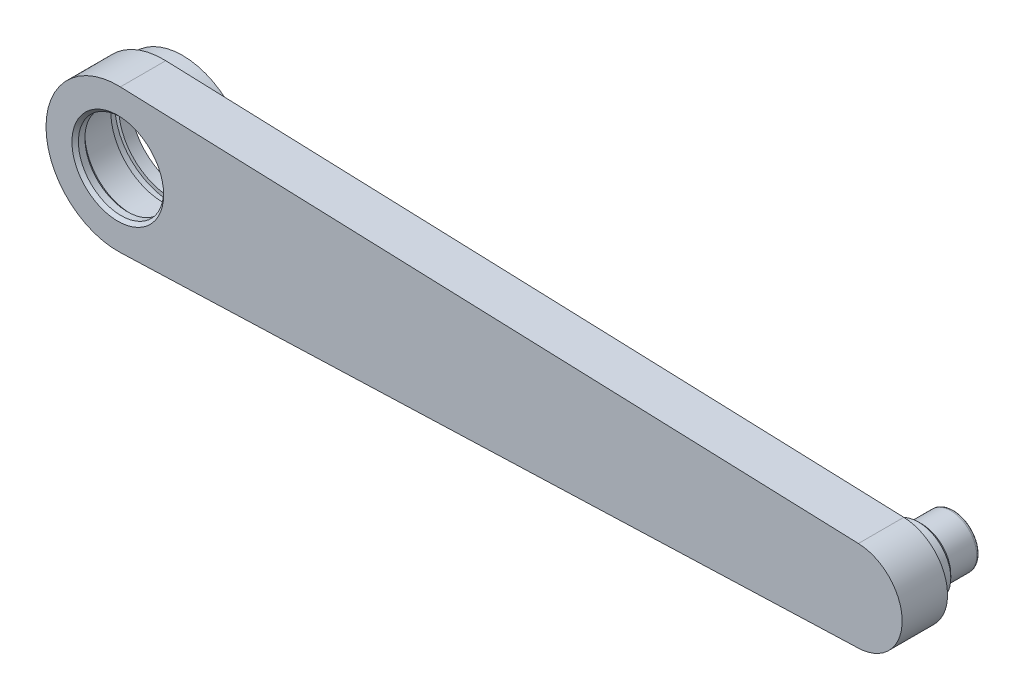
ISO-10303-21;
HEADER;
FILE_DESCRIPTION(('STEP AP214'),'2;1');
FILE_NAME('part.step','',(''),(''),'','','');
FILE_SCHEMA(('AUTOMOTIVE_DESIGN { 1 0 10303 214 1 1 1 1 }'));
ENDSEC;
DATA;
#1=APPLICATION_CONTEXT('core data for automotive mechanical design processes');
#2=APPLICATION_PROTOCOL_DEFINITION('international standard','automotive_design',2000,#1);
#3=PRODUCT_CONTEXT('',#1,'mechanical');
#4=PRODUCT('Part','Part','',(#3));
#5=PRODUCT_RELATED_PRODUCT_CATEGORY('part','',(#4));
#6=PRODUCT_DEFINITION_FORMATION('','',#4);
#7=PRODUCT_DEFINITION_CONTEXT('part definition',#1,'design');
#8=PRODUCT_DEFINITION('design','',#6,#7);
#9=PRODUCT_DEFINITION_SHAPE('','',#8);
#10=(LENGTH_UNIT() NAMED_UNIT(*) SI_UNIT(.MILLI.,.METRE.));
#11=(NAMED_UNIT(*) PLANE_ANGLE_UNIT() SI_UNIT($,.RADIAN.));
#12=(NAMED_UNIT(*) SI_UNIT($,.STERADIAN.) SOLID_ANGLE_UNIT());
#13=UNCERTAINTY_MEASURE_WITH_UNIT(LENGTH_MEASURE(1.E-05),#10,'distance_accuracy_value','');
#14=(GEOMETRIC_REPRESENTATION_CONTEXT(3) GLOBAL_UNCERTAINTY_ASSIGNED_CONTEXT((#13)) GLOBAL_UNIT_ASSIGNED_CONTEXT((#10,
#11,#12)) REPRESENTATION_CONTEXT('',''));
#15=CARTESIAN_POINT('',(0.,0.,0.));
#16=DIRECTION('',(0.,0.,1.));
#17=DIRECTION('',(1.,0.,0.));
#18=AXIS2_PLACEMENT_3D('',#15,#16,#17);
#19=CARTESIAN_POINT('',(0.,0.,7.));
#20=DIRECTION('',(0.,0.,-1.));
#21=DIRECTION('',(-1.,0.,0.));
#22=AXIS2_PLACEMENT_3D('',#19,#20,#21);
#23=CYLINDRICAL_SURFACE('',#22,8.075);
#24=CARTESIAN_POINT('',(0.,0.,-3.));
#25=DIRECTION('',(0.,0.,-1.));
#26=DIRECTION('',(-1.,0.,0.));
#27=AXIS2_PLACEMENT_3D('',#24,#25,#26);
#28=CIRCLE('',#27,8.075);
#29=CARTESIAN_POINT('',(-8.075,0.,-3.));
#30=VERTEX_POINT('',#29);
#31=EDGE_CURVE('E160',#30,#30,#28,.T.);
#32=ORIENTED_EDGE('',*,*,#31,.T.);
#33=EDGE_LOOP('',(#32));
#34=FACE_BOUND('',#33,.T.);
#35=CARTESIAN_POINT('',(0.,0.,-1.2));
#36=DIRECTION('',(0.,0.,1.));
#37=DIRECTION('',(1.,0.,0.));
#38=AXIS2_PLACEMENT_3D('',#35,#36,#37);
#39=CIRCLE('',#38,8.075);
#40=CARTESIAN_POINT('',(8.075,0.,-1.2));
#41=VERTEX_POINT('',#40);
#42=EDGE_CURVE('E51',#41,#41,#39,.T.);
#43=ORIENTED_EDGE('',*,*,#42,.T.);
#44=EDGE_LOOP('',(#43));
#45=FACE_BOUND('',#44,.T.);
#46=ADVANCED_FACE('F50',(#34,#45),#23,.F.);
#47=CARTESIAN_POINT('',(0.,0.,0.));
#48=DIRECTION('',(0.,0.,1.));
#49=DIRECTION('',(1.,0.,0.));
#50=AXIS2_PLACEMENT_3D('',#47,#48,#49);
#51=PLANE('',#50);
#52=DIRECTION('',(0.999359513847041,0.0357849421321992,0.));
#53=VECTOR('',#52,1.);
#54=CARTESIAN_POINT('',(0.396318234114106,-11.067906615856,0.));
#55=LINE('',#54,#53);
#56=CARTESIAN_POINT('',(0.396318234114106,-11.067906615856,0.));
#57=VERTEX_POINT('',#56);
#58=CARTESIAN_POINT('',(114.,-7.00000000000001,0.));
#59=VERTEX_POINT('',#58);
#60=EDGE_CURVE('E116',#57,#59,#55,.T.);
#61=ORIENTED_EDGE('',*,*,#60,.F.);
#62=CARTESIAN_POINT('',(0.,0.,0.));
#63=DIRECTION('',(0.,0.,1.));
#64=DIRECTION('',(1.,0.,0.));
#65=AXIS2_PLACEMENT_3D('',#62,#63,#64);
#66=CIRCLE('',#65,11.075);
#67=CARTESIAN_POINT('',(0.395882675438596,11.067922203706,0.));
#68=VERTEX_POINT('',#67);
#69=EDGE_CURVE('E83',#68,#57,#66,.T.);
#70=ORIENTED_EDGE('',*,*,#69,.F.);
#71=DIRECTION('',(0.999360921327853,-0.0357456140350877,0.));
#72=VECTOR('',#71,1.);
#73=CARTESIAN_POINT('',(0.395882675438596,11.067922203706,0.));
#74=LINE('',#73,#72);
#75=CARTESIAN_POINT('',(114.250219298246,6.99552644929498,0.));
#76=VERTEX_POINT('',#75);
#77=EDGE_CURVE('E122',#68,#76,#74,.T.);
#78=ORIENTED_EDGE('',*,*,#77,.T.);
#79=CARTESIAN_POINT('',(114.,0.,0.));
#80=DIRECTION('',(0.,0.,1.));
#81=DIRECTION('',(1.,0.,0.));
#82=AXIS2_PLACEMENT_3D('',#79,#80,#81);
#83=CIRCLE('',#82,7.00000000000002);
#84=EDGE_CURVE('E104',#59,#76,#83,.T.);
#85=ORIENTED_EDGE('',*,*,#84,.F.);
#86=EDGE_LOOP('',(#61,#70,#78,#85));
#87=FACE_BOUND('',#86,.T.);
#88=CARTESIAN_POINT('',(114.,0.,0.));
#89=DIRECTION('',(0.,0.,1.));
#90=DIRECTION('',(1.,0.,0.));
#91=AXIS2_PLACEMENT_3D('',#88,#89,#90);
#92=CIRCLE('',#91,5.);
#93=CARTESIAN_POINT('',(119.,0.,0.));
#94=VERTEX_POINT('',#93);
#95=EDGE_CURVE('E129',#94,#94,#92,.F.);
#96=ORIENTED_EDGE('',*,*,#95,.F.);
#97=EDGE_LOOP('',(#96));
#98=FACE_BOUND('',#97,.T.);
#99=CARTESIAN_POINT('',(0.,0.,0.));
#100=DIRECTION('',(0.,0.,1.));
#101=DIRECTION('',(1.,0.,0.));
#102=AXIS2_PLACEMENT_3D('',#99,#100,#101);
#103=CIRCLE('',#102,10.075);
#104=CARTESIAN_POINT('',(10.075,0.,0.));
#105=VERTEX_POINT('',#104);
#106=EDGE_CURVE('E11',#105,#105,#103,.F.);
#107=ORIENTED_EDGE('',*,*,#106,.F.);
#108=EDGE_LOOP('',(#107));
#109=FACE_BOUND('',#108,.T.);
#110=ADVANCED_FACE('F205',(#87,#98,#109),#51,.F.);
#111=CARTESIAN_POINT('',(114.,0.,-10.));
#112=DIRECTION('',(0.,0.,1.));
#113=DIRECTION('',(1.,0.,0.));
#114=AXIS2_PLACEMENT_3D('',#111,#112,#113);
#115=CYLINDRICAL_SURFACE('',#114,4.00000000000001);
#116=CARTESIAN_POINT('',(114.,0.,-7.5));
#117=DIRECTION('',(0.,0.,-1.));
#118=DIRECTION('',(-1.,0.,0.));
#119=AXIS2_PLACEMENT_3D('',#116,#117,#118);
#120=CIRCLE('',#119,4.00000000000001);
#121=CARTESIAN_POINT('',(110.,0.,-7.5));
#122=VERTEX_POINT('',#121);
#123=EDGE_CURVE('E60',#122,#122,#120,.F.);
#124=ORIENTED_EDGE('',*,*,#123,.T.);
#125=EDGE_LOOP('',(#124));
#126=FACE_BOUND('',#125,.T.);
#127=CARTESIAN_POINT('',(114.,0.,-3.));
#128=DIRECTION('',(0.,0.,-1.));
#129=DIRECTION('',(-1.,0.,0.));
#130=AXIS2_PLACEMENT_3D('',#127,#128,#129);
#131=CIRCLE('',#130,4.00000000000001);
#132=CARTESIAN_POINT('',(110.,0.,-3.));
#133=VERTEX_POINT('',#132);
#134=EDGE_CURVE('E176',#133,#133,#131,.T.);
#135=ORIENTED_EDGE('',*,*,#134,.T.);
#136=EDGE_LOOP('',(#135));
#137=FACE_BOUND('',#136,.T.);
#138=ADVANCED_FACE('F212',(#126,#137),#115,.T.);
#139=CARTESIAN_POINT('',(0.,0.,0.));
#140=DIRECTION('',(0.,0.,1.));
#141=DIRECTION('',(1.,0.,0.));
#142=AXIS2_PLACEMENT_3D('',#139,#140,#141);
#143=CIRCLE('',#142,8.075);
#144=CARTESIAN_POINT('',(8.075,0.,0.));
#145=VERTEX_POINT('',#144);
#146=EDGE_CURVE('E155',#145,#145,#143,.T.);
#147=ORIENTED_EDGE('',*,*,#146,.F.);
#148=EDGE_LOOP('',(#147));
#149=FACE_BOUND('',#148,.T.);
#150=CARTESIAN_POINT('',(0.,0.,5.));
#151=DIRECTION('',(0.,0.,1.));
#152=DIRECTION('',(1.,0.,0.));
#153=AXIS2_PLACEMENT_3D('',#150,#151,#152);
#154=CIRCLE('',#153,8.075);
#155=CARTESIAN_POINT('',(8.075,0.,5.));
#156=VERTEX_POINT('',#155);
#157=EDGE_CURVE('E118',#156,#156,#154,.T.);
#158=ORIENTED_EDGE('',*,*,#157,.T.);
#159=EDGE_LOOP('',(#158));
#160=FACE_BOUND('',#159,.T.);
#161=ADVANCED_FACE('F183',(#149,#160),#23,.F.);
#162=CARTESIAN_POINT('',(0.396318234114106,-11.067906615856,7.));
#163=DIRECTION('',(-0.0357849421321992,0.999359513847041,0.));
#164=DIRECTION('',(-0.999359513847041,-0.0357849421321992,0.));
#165=AXIS2_PLACEMENT_3D('',#162,#163,#164);
#166=PLANE('',#165);
#167=ORIENTED_EDGE('',*,*,#60,.T.);
#168=DIRECTION('',(0.,0.,-1.));
#169=VECTOR('',#168,1.);
#170=CARTESIAN_POINT('',(114.,-7.00000000000001,7.));
#171=LINE('',#170,#169);
#172=CARTESIAN_POINT('',(114.,-7.00000000000001,7.));
#173=VERTEX_POINT('',#172);
#174=EDGE_CURVE('E108',#173,#59,#171,.T.);
#175=ORIENTED_EDGE('',*,*,#174,.F.);
#176=DIRECTION('',(0.999359513847041,0.0357849421321992,0.));
#177=VECTOR('',#176,1.);
#178=CARTESIAN_POINT('',(0.396318234114106,-11.067906615856,7.));
#179=LINE('',#178,#177);
#180=CARTESIAN_POINT('',(0.396318234114106,-11.067906615856,7.));
#181=VERTEX_POINT('',#180);
#182=EDGE_CURVE('E96',#181,#173,#179,.T.);
#183=ORIENTED_EDGE('',*,*,#182,.F.);
#184=DIRECTION('',(0.,0.,-1.));
#185=VECTOR('',#184,1.);
#186=CARTESIAN_POINT('',(0.396318234114106,-11.067906615856,7.));
#187=LINE('',#186,#185);
#188=EDGE_CURVE('E115',#181,#57,#187,.T.);
#189=ORIENTED_EDGE('',*,*,#188,.T.);
#190=EDGE_LOOP('',(#167,#175,#183,#189));
#191=FACE_BOUND('',#190,.T.);
#192=ADVANCED_FACE('F218',(#191),#166,.F.);
#193=CARTESIAN_POINT('',(114.,0.,7.));
#194=DIRECTION('',(0.,0.,-1.));
#195=DIRECTION('',(-1.,0.,0.));
#196=AXIS2_PLACEMENT_3D('',#193,#194,#195);
#197=CYLINDRICAL_SURFACE('',#196,7.00000000000002);
#198=ORIENTED_EDGE('',*,*,#84,.T.);
#199=DIRECTION('',(0.,0.,-1.));
#200=VECTOR('',#199,1.);
#201=CARTESIAN_POINT('',(114.250219298246,6.99552644929498,7.));
#202=LINE('',#201,#200);
#203=CARTESIAN_POINT('',(114.250219298246,6.99552644929498,7.));
#204=VERTEX_POINT('',#203);
#205=EDGE_CURVE('E105',#204,#76,#202,.T.);
#206=ORIENTED_EDGE('',*,*,#205,.F.);
#207=CARTESIAN_POINT('',(114.,0.,7.));
#208=DIRECTION('',(0.,0.,1.));
#209=DIRECTION('',(1.,0.,0.));
#210=AXIS2_PLACEMENT_3D('',#207,#208,#209);
#211=CIRCLE('',#210,7.00000000000002);
#212=EDGE_CURVE('E95',#173,#204,#211,.T.);
#213=ORIENTED_EDGE('',*,*,#212,.F.);
#214=ORIENTED_EDGE('',*,*,#174,.T.);
#215=EDGE_LOOP('',(#198,#206,#213,#214));
#216=FACE_BOUND('',#215,.T.);
#217=ADVANCED_FACE('F101',(#216),#197,.T.);
#218=CARTESIAN_POINT('',(0.395882675438596,11.067922203706,7.));
#219=DIRECTION('',(0.0357456140350877,0.999360921327853,0.));
#220=DIRECTION('',(-0.999360921327853,0.0357456140350877,0.));
#221=AXIS2_PLACEMENT_3D('',#218,#219,#220);
#222=PLANE('',#221);
#223=ORIENTED_EDGE('',*,*,#77,.F.);
#224=DIRECTION('',(0.,0.,-1.));
#225=VECTOR('',#224,1.);
#226=CARTESIAN_POINT('',(0.395882675438596,11.067922203706,7.));
#227=LINE('',#226,#225);
#228=CARTESIAN_POINT('',(0.395882675438596,11.067922203706,7.));
#229=VERTEX_POINT('',#228);
#230=EDGE_CURVE('E84',#229,#68,#227,.T.);
#231=ORIENTED_EDGE('',*,*,#230,.F.);
#232=DIRECTION('',(0.999360921327853,-0.0357456140350877,0.));
#233=VECTOR('',#232,1.);
#234=CARTESIAN_POINT('',(0.395882675438596,11.067922203706,7.));
#235=LINE('',#234,#233);
#236=EDGE_CURVE('E98',#229,#204,#235,.T.);
#237=ORIENTED_EDGE('',*,*,#236,.T.);
#238=ORIENTED_EDGE('',*,*,#205,.T.);
#239=EDGE_LOOP('',(#223,#231,#237,#238));
#240=FACE_BOUND('',#239,.T.);
#241=ADVANCED_FACE('F109',(#240),#222,.T.);
#242=CARTESIAN_POINT('',(0.,0.,7.));
#243=DIRECTION('',(0.,0.,-1.));
#244=DIRECTION('',(-1.,0.,0.));
#245=AXIS2_PLACEMENT_3D('',#242,#243,#244);
#246=CYLINDRICAL_SURFACE('',#245,11.075);
#247=ORIENTED_EDGE('',*,*,#69,.T.);
#248=ORIENTED_EDGE('',*,*,#188,.F.);
#249=CARTESIAN_POINT('',(0.,0.,7.));
#250=DIRECTION('',(0.,0.,1.));
#251=DIRECTION('',(1.,0.,0.));
#252=AXIS2_PLACEMENT_3D('',#249,#250,#251);
#253=CIRCLE('',#252,11.075);
#254=EDGE_CURVE('E68',#229,#181,#253,.T.);
#255=ORIENTED_EDGE('',*,*,#254,.F.);
#256=ORIENTED_EDGE('',*,*,#230,.T.);
#257=EDGE_LOOP('',(#247,#248,#255,#256));
#258=FACE_BOUND('',#257,.T.);
#259=ADVANCED_FACE('F199',(#258),#246,.T.);
#260=CARTESIAN_POINT('',(0.,0.,7.));
#261=DIRECTION('',(0.,0.,1.));
#262=DIRECTION('',(1.,0.,0.));
#263=AXIS2_PLACEMENT_3D('',#260,#261,#262);
#264=PLANE('',#263);
#265=CARTESIAN_POINT('',(0.,0.,7.));
#266=DIRECTION('',(0.,0.,1.));
#267=DIRECTION('',(1.,0.,0.));
#268=AXIS2_PLACEMENT_3D('',#265,#266,#267);
#269=CIRCLE('',#268,7.07500000000004);
#270=CARTESIAN_POINT('',(7.07500000000004,0.,7.));
#271=VERTEX_POINT('',#270);
#272=EDGE_CURVE('E139',#271,#271,#269,.F.);
#273=ORIENTED_EDGE('',*,*,#272,.T.);
#274=EDGE_LOOP('',(#273));
#275=FACE_BOUND('',#274,.T.);
#276=ORIENTED_EDGE('',*,*,#182,.T.);
#277=ORIENTED_EDGE('',*,*,#212,.T.);
#278=ORIENTED_EDGE('',*,*,#236,.F.);
#279=ORIENTED_EDGE('',*,*,#254,.T.);
#280=EDGE_LOOP('',(#276,#277,#278,#279));
#281=FACE_BOUND('',#280,.T.);
#282=ADVANCED_FACE('F93',(#275,#281),#264,.T.);
#283=CARTESIAN_POINT('',(0.,0.,5.));
#284=DIRECTION('',(0.,0.,1.));
#285=DIRECTION('',(1.,0.,0.));
#286=AXIS2_PLACEMENT_3D('',#283,#284,#285);
#287=PLANE('',#286);
#288=CARTESIAN_POINT('',(0.,0.,5.));
#289=DIRECTION('',(0.,0.,1.));
#290=DIRECTION('',(1.,0.,0.));
#291=AXIS2_PLACEMENT_3D('',#288,#289,#290);
#292=CIRCLE('',#291,7.075);
#293=CARTESIAN_POINT('',(7.075,0.,5.));
#294=VERTEX_POINT('',#293);
#295=EDGE_CURVE('E138',#294,#294,#292,.T.);
#296=ORIENTED_EDGE('',*,*,#295,.T.);
#297=EDGE_LOOP('',(#296));
#298=FACE_BOUND('',#297,.T.);
#299=ORIENTED_EDGE('',*,*,#157,.F.);
#300=EDGE_LOOP('',(#299));
#301=FACE_BOUND('',#300,.T.);
#302=ADVANCED_FACE('F187',(#298,#301),#287,.F.);
#303=CARTESIAN_POINT('',(0.,0.,5.));
#304=DIRECTION('',(0.,0.,1.));
#305=DIRECTION('',(1.,0.,0.));
#306=AXIS2_PLACEMENT_3D('',#303,#304,#305);
#307=CYLINDRICAL_SURFACE('',#306,6.575);
#308=CARTESIAN_POINT('',(0.,0.,6.49999999999995));
#309=DIRECTION('',(0.,0.,1.));
#310=DIRECTION('',(1.,0.,0.));
#311=AXIS2_PLACEMENT_3D('',#308,#309,#310);
#312=CIRCLE('',#311,6.575);
#313=CARTESIAN_POINT('',(6.575,0.,6.49999999999995));
#314=VERTEX_POINT('',#313);
#315=EDGE_CURVE('E131',#314,#314,#312,.T.);
#316=ORIENTED_EDGE('',*,*,#315,.T.);
#317=EDGE_LOOP('',(#316));
#318=FACE_BOUND('',#317,.T.);
#319=CARTESIAN_POINT('',(0.,0.,5.49999999999999));
#320=DIRECTION('',(0.,0.,1.));
#321=DIRECTION('',(1.,0.,0.));
#322=AXIS2_PLACEMENT_3D('',#319,#320,#321);
#323=CIRCLE('',#322,6.575);
#324=CARTESIAN_POINT('',(6.575,0.,5.49999999999999));
#325=VERTEX_POINT('',#324);
#326=EDGE_CURVE('E128',#325,#325,#323,.F.);
#327=ORIENTED_EDGE('',*,*,#326,.T.);
#328=EDGE_LOOP('',(#327));
#329=FACE_BOUND('',#328,.T.);
#330=ADVANCED_FACE('F189',(#318,#329),#307,.F.);
#331=CARTESIAN_POINT('',(114.,0.,-3.));
#332=DIRECTION('',(0.,0.,-1.));
#333=DIRECTION('',(-1.,0.,0.));
#334=AXIS2_PLACEMENT_3D('',#331,#332,#333);
#335=PLANE('',#334);
#336=CARTESIAN_POINT('',(114.,0.,-3.));
#337=DIRECTION('',(0.,0.,-1.));
#338=DIRECTION('',(-1.,0.,0.));
#339=AXIS2_PLACEMENT_3D('',#336,#337,#338);
#340=CIRCLE('',#339,4.50000000000002);
#341=CARTESIAN_POINT('',(109.5,0.,-3.));
#342=VERTEX_POINT('',#341);
#343=EDGE_CURVE('E145',#342,#342,#340,.T.);
#344=ORIENTED_EDGE('',*,*,#343,.T.);
#345=EDGE_LOOP('',(#344));
#346=FACE_BOUND('',#345,.T.);
#347=ORIENTED_EDGE('',*,*,#134,.F.);
#348=EDGE_LOOP('',(#347));
#349=FACE_BOUND('',#348,.T.);
#350=ADVANCED_FACE('F193',(#346,#349),#335,.T.);
#351=CARTESIAN_POINT('',(114.,0.,-3.));
#352=DIRECTION('',(0.,0.,1.));
#353=DIRECTION('',(1.,0.,0.));
#354=AXIS2_PLACEMENT_3D('',#351,#352,#353);
#355=CYLINDRICAL_SURFACE('',#354,5.);
#356=CARTESIAN_POINT('',(114.,0.,-2.5));
#357=DIRECTION('',(0.,0.,-1.));
#358=DIRECTION('',(-1.,0.,0.));
#359=AXIS2_PLACEMENT_3D('',#356,#357,#358);
#360=CIRCLE('',#359,5.);
#361=CARTESIAN_POINT('',(109.,0.,-2.5));
#362=VERTEX_POINT('',#361);
#363=EDGE_CURVE('E143',#362,#362,#360,.F.);
#364=ORIENTED_EDGE('',*,*,#363,.T.);
#365=EDGE_LOOP('',(#364));
#366=FACE_BOUND('',#365,.T.);
#367=ORIENTED_EDGE('',*,*,#95,.T.);
#368=EDGE_LOOP('',(#367));
#369=FACE_BOUND('',#368,.T.);
#370=ADVANCED_FACE('F231',(#366,#369),#355,.T.);
#371=CARTESIAN_POINT('',(0.,0.,6.49999999999995));
#372=DIRECTION('',(0.,0.,1.));
#373=DIRECTION('',(1.,0.,0.));
#374=AXIS2_PLACEMENT_3D('',#371,#372,#373);
#375=CONICAL_SURFACE('',#374,6.575,0.78539816339744);
#376=ORIENTED_EDGE('',*,*,#272,.F.);
#377=EDGE_LOOP('',(#376));
#378=FACE_BOUND('',#377,.T.);
#379=ORIENTED_EDGE('',*,*,#315,.F.);
#380=EDGE_LOOP('',(#379));
#381=FACE_BOUND('',#380,.T.);
#382=ADVANCED_FACE('F236',(#378,#381),#375,.F.);
#383=CARTESIAN_POINT('',(0.,0.,5.));
#384=DIRECTION('',(0.,0.,-1.));
#385=DIRECTION('',(-1.,0.,0.));
#386=AXIS2_PLACEMENT_3D('',#383,#384,#385);
#387=CONICAL_SURFACE('',#386,7.075,0.785398163397458);
#388=ORIENTED_EDGE('',*,*,#326,.F.);
#389=EDGE_LOOP('',(#388));
#390=FACE_BOUND('',#389,.T.);
#391=ORIENTED_EDGE('',*,*,#295,.F.);
#392=EDGE_LOOP('',(#391));
#393=FACE_BOUND('',#392,.T.);
#394=ADVANCED_FACE('F360',(#390,#393),#387,.F.);
#395=CARTESIAN_POINT('',(114.,0.,-3.));
#396=DIRECTION('',(0.,0.,1.));
#397=DIRECTION('',(1.,0.,0.));
#398=AXIS2_PLACEMENT_3D('',#395,#396,#397);
#399=CONICAL_SURFACE('',#398,4.50000000000002,0.785398163397438);
#400=ORIENTED_EDGE('',*,*,#363,.F.);
#401=EDGE_LOOP('',(#400));
#402=FACE_BOUND('',#401,.T.);
#403=ORIENTED_EDGE('',*,*,#343,.F.);
#404=EDGE_LOOP('',(#403));
#405=FACE_BOUND('',#404,.T.);
#406=ADVANCED_FACE('F242',(#402,#405),#399,.T.);
#407=CARTESIAN_POINT('',(114.,0.,-8.));
#408=DIRECTION('',(0.,0.,-1.));
#409=DIRECTION('',(-1.,0.,0.));
#410=AXIS2_PLACEMENT_3D('',#407,#408,#409);
#411=PLANE('',#410);
#412=CARTESIAN_POINT('',(114.,0.,-8.));
#413=DIRECTION('',(0.,0.,-1.));
#414=DIRECTION('',(-1.,0.,0.));
#415=AXIS2_PLACEMENT_3D('',#412,#413,#414);
#416=CIRCLE('',#415,2.2);
#417=CARTESIAN_POINT('',(111.8,0.,-8.));
#418=VERTEX_POINT('',#417);
#419=EDGE_CURVE('E175',#418,#418,#416,.T.);
#420=ORIENTED_EDGE('',*,*,#419,.F.);
#421=EDGE_LOOP('',(#420));
#422=FACE_BOUND('',#421,.T.);
#423=CARTESIAN_POINT('',(114.,0.,-8.));
#424=DIRECTION('',(0.,0.,-1.));
#425=DIRECTION('',(-1.,0.,0.));
#426=AXIS2_PLACEMENT_3D('',#423,#424,#425);
#427=CIRCLE('',#426,3.50000000000001);
#428=CARTESIAN_POINT('',(110.5,0.,-8.));
#429=VERTEX_POINT('',#428);
#430=EDGE_CURVE('E150',#429,#429,#427,.T.);
#431=ORIENTED_EDGE('',*,*,#430,.T.);
#432=EDGE_LOOP('',(#431));
#433=FACE_BOUND('',#432,.T.);
#434=ADVANCED_FACE('F241',(#422,#433),#411,.T.);
#435=CARTESIAN_POINT('',(114.,0.,-7.5));
#436=DIRECTION('',(0.,0.,-1.));
#437=DIRECTION('',(-1.,0.,0.));
#438=AXIS2_PLACEMENT_3D('',#435,#436,#437);
#439=TOROIDAL_SURFACE('',#438,3.50000000000001,0.5);
#440=ORIENTED_EDGE('',*,*,#123,.F.);
#441=EDGE_LOOP('',(#440));
#442=FACE_BOUND('',#441,.T.);
#443=ORIENTED_EDGE('',*,*,#430,.F.);
#444=EDGE_LOOP('',(#443));
#445=FACE_BOUND('',#444,.T.);
#446=ADVANCED_FACE('F47',(#442,#445),#439,.T.);
#447=CARTESIAN_POINT('',(114.,0.,2.));
#448=DIRECTION('',(0.,0.,-1.));
#449=DIRECTION('',(-1.,0.,0.));
#450=AXIS2_PLACEMENT_3D('',#447,#448,#449);
#451=CYLINDRICAL_SURFACE('',#450,2.2);
#452=CARTESIAN_POINT('',(114.,0.,2.));
#453=DIRECTION('',(0.,0.,-1.));
#454=DIRECTION('',(-1.,0.,0.));
#455=AXIS2_PLACEMENT_3D('',#452,#453,#454);
#456=CIRCLE('',#455,2.2);
#457=CARTESIAN_POINT('',(111.8,0.,2.));
#458=VERTEX_POINT('',#457);
#459=EDGE_CURVE('E173',#458,#458,#456,.T.);
#460=ORIENTED_EDGE('',*,*,#459,.F.);
#461=EDGE_LOOP('',(#460));
#462=FACE_BOUND('',#461,.T.);
#463=ORIENTED_EDGE('',*,*,#419,.T.);
#464=EDGE_LOOP('',(#463));
#465=FACE_BOUND('',#464,.T.);
#466=ADVANCED_FACE('F246',(#462,#465),#451,.F.);
#467=CARTESIAN_POINT('',(114.,0.,2.));
#468=DIRECTION('',(0.,0.,-1.));
#469=DIRECTION('',(-1.,0.,0.));
#470=AXIS2_PLACEMENT_3D('',#467,#468,#469);
#471=PLANE('',#470);
#472=ORIENTED_EDGE('',*,*,#459,.T.);
#473=EDGE_LOOP('',(#472));
#474=FACE_BOUND('',#473,.T.);
#475=ADVANCED_FACE('F248',(#474),#471,.T.);
#476=CARTESIAN_POINT('',(0.,0.,-3.));
#477=DIRECTION('',(0.,0.,-1.));
#478=DIRECTION('',(-1.,0.,0.));
#479=AXIS2_PLACEMENT_3D('',#476,#477,#478);
#480=PLANE('',#479);
#481=CARTESIAN_POINT('',(0.,0.,-3.));
#482=DIRECTION('',(0.,0.,-1.));
#483=DIRECTION('',(-1.,0.,0.));
#484=AXIS2_PLACEMENT_3D('',#481,#482,#483);
#485=CIRCLE('',#484,10.075);
#486=CARTESIAN_POINT('',(-10.075,0.,-3.));
#487=VERTEX_POINT('',#486);
#488=EDGE_CURVE('E169',#487,#487,#485,.T.);
#489=ORIENTED_EDGE('',*,*,#488,.T.);
#490=EDGE_LOOP('',(#489));
#491=FACE_BOUND('',#490,.T.);
#492=ORIENTED_EDGE('',*,*,#31,.F.);
#493=EDGE_LOOP('',(#492));
#494=FACE_BOUND('',#493,.T.);
#495=ADVANCED_FACE('F254',(#491,#494),#480,.T.);
#496=CARTESIAN_POINT('',(0.,0.,-3.));
#497=DIRECTION('',(0.,0.,1.));
#498=DIRECTION('',(1.,0.,0.));
#499=AXIS2_PLACEMENT_3D('',#496,#497,#498);
#500=CYLINDRICAL_SURFACE('',#499,10.075);
#501=ORIENTED_EDGE('',*,*,#488,.F.);
#502=EDGE_LOOP('',(#501));
#503=FACE_BOUND('',#502,.T.);
#504=ORIENTED_EDGE('',*,*,#106,.T.);
#505=EDGE_LOOP('',(#504));
#506=FACE_BOUND('',#505,.T.);
#507=ADVANCED_FACE('F253',(#503,#506),#500,.T.);
#508=CARTESIAN_POINT('',(0.,0.,0.));
#509=DIRECTION('',(0.,0.,1.));
#510=DIRECTION('',(1.,0.,0.));
#511=AXIS2_PLACEMENT_3D('',#508,#509,#510);
#512=CYLINDRICAL_SURFACE('',#511,8.65);
#513=CARTESIAN_POINT('',(0.,0.,0.));
#514=DIRECTION('',(0.,0.,1.));
#515=DIRECTION('',(1.,0.,0.));
#516=AXIS2_PLACEMENT_3D('',#513,#514,#515);
#517=CIRCLE('',#516,8.65);
#518=CARTESIAN_POINT('',(8.65,0.,0.));
#519=VERTEX_POINT('',#518);
#520=EDGE_CURVE('E157',#519,#519,#517,.T.);
#521=ORIENTED_EDGE('',*,*,#520,.T.);
#522=EDGE_LOOP('',(#521));
#523=FACE_BOUND('',#522,.T.);
#524=CARTESIAN_POINT('',(0.,0.,-1.2));
#525=DIRECTION('',(0.,0.,1.));
#526=DIRECTION('',(1.,0.,0.));
#527=AXIS2_PLACEMENT_3D('',#524,#525,#526);
#528=CIRCLE('',#527,8.65);
#529=CARTESIAN_POINT('',(8.65,0.,-1.2));
#530=VERTEX_POINT('',#529);
#531=EDGE_CURVE('E154',#530,#530,#528,.T.);
#532=ORIENTED_EDGE('',*,*,#531,.F.);
#533=EDGE_LOOP('',(#532));
#534=FACE_BOUND('',#533,.T.);
#535=ADVANCED_FACE('F259',(#523,#534),#512,.F.);
#536=CARTESIAN_POINT('',(0.,0.,-1.2));
#537=DIRECTION('',(0.,0.,1.));
#538=DIRECTION('',(1.,0.,0.));
#539=AXIS2_PLACEMENT_3D('',#536,#537,#538);
#540=PLANE('',#539);
#541=ORIENTED_EDGE('',*,*,#42,.F.);
#542=EDGE_LOOP('',(#541));
#543=FACE_BOUND('',#542,.T.);
#544=ORIENTED_EDGE('',*,*,#531,.T.);
#545=EDGE_LOOP('',(#544));
#546=FACE_BOUND('',#545,.T.);
#547=ADVANCED_FACE('F261',(#543,#546),#540,.T.);
#548=CARTESIAN_POINT('',(0.,0.,0.));
#549=DIRECTION('',(0.,0.,1.));
#550=DIRECTION('',(1.,0.,0.));
#551=AXIS2_PLACEMENT_3D('',#548,#549,#550);
#552=PLANE('',#551);
#553=ORIENTED_EDGE('',*,*,#146,.T.);
#554=EDGE_LOOP('',(#553));
#555=FACE_BOUND('',#554,.T.);
#556=ORIENTED_EDGE('',*,*,#520,.F.);
#557=EDGE_LOOP('',(#556));
#558=FACE_BOUND('',#557,.T.);
#559=ADVANCED_FACE('F266',(#555,#558),#552,.F.);
#560=CLOSED_SHELL('',(#46,#110,#138,#161,#192,#217,#241,#259,#282,#302,#330,#350,#370,#382,#394,
#406,#434,#446,#466,#475,#495,#507,#535,#547,#559));
#561=MANIFOLD_SOLID_BREP('B2',#560);
#562=ADVANCED_BREP_SHAPE_REPRESENTATION('',(#18,#561),#14);
#563=SHAPE_DEFINITION_REPRESENTATION(#9,#562);
ENDSEC;
END-ISO-10303-21;
